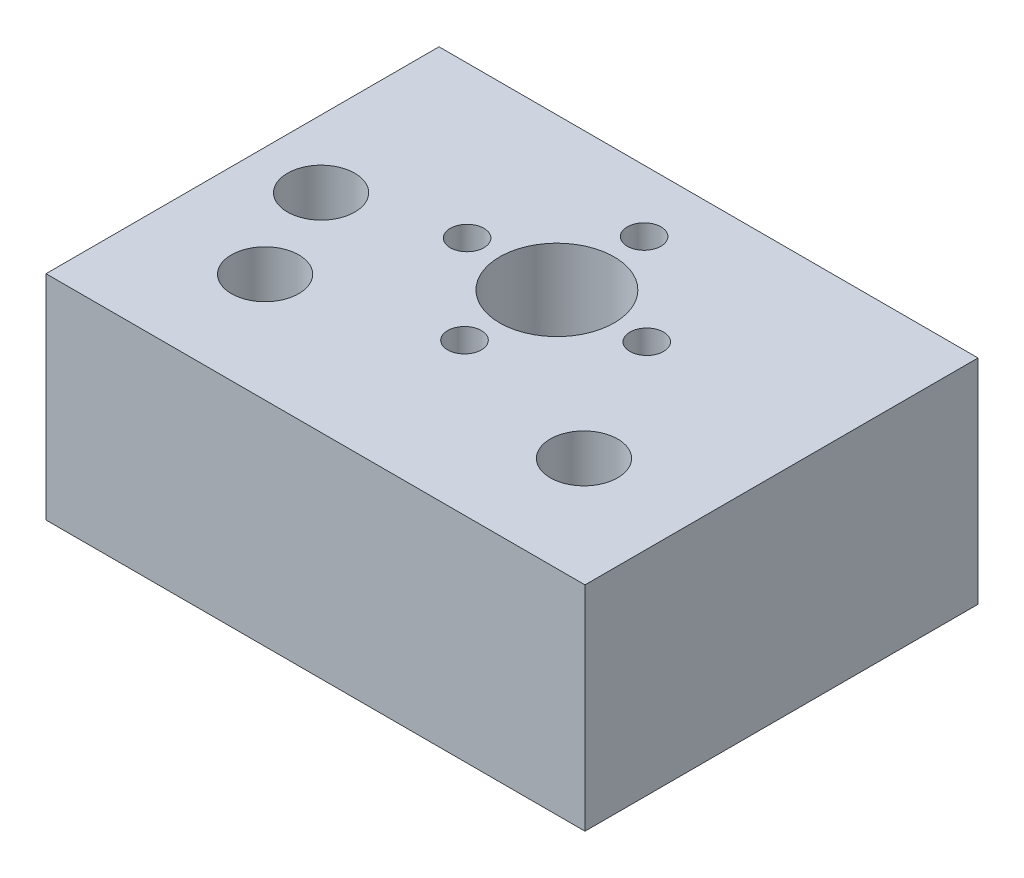
ISO-10303-21;
HEADER;
FILE_DESCRIPTION(('STEP AP214'),'2;1');
FILE_NAME('part.step','',(''),(''),'','','');
FILE_SCHEMA(('AUTOMOTIVE_DESIGN { 1 0 10303 214 1 1 1 1 }'));
ENDSEC;
DATA;
#1=APPLICATION_CONTEXT('core data for automotive mechanical design processes');
#2=APPLICATION_PROTOCOL_DEFINITION('international standard','automotive_design',2000,#1);
#3=PRODUCT_CONTEXT('',#1,'mechanical');
#4=PRODUCT('Part','Part','',(#3));
#5=PRODUCT_RELATED_PRODUCT_CATEGORY('part','',(#4));
#6=PRODUCT_DEFINITION_FORMATION('','',#4);
#7=PRODUCT_DEFINITION_CONTEXT('part definition',#1,'design');
#8=PRODUCT_DEFINITION('design','',#6,#7);
#9=PRODUCT_DEFINITION_SHAPE('','',#8);
#10=(LENGTH_UNIT() NAMED_UNIT(*) SI_UNIT(.MILLI.,.METRE.));
#11=(NAMED_UNIT(*) PLANE_ANGLE_UNIT() SI_UNIT($,.RADIAN.));
#12=(NAMED_UNIT(*) SI_UNIT($,.STERADIAN.) SOLID_ANGLE_UNIT());
#13=UNCERTAINTY_MEASURE_WITH_UNIT(LENGTH_MEASURE(1.E-05),#10,'distance_accuracy_value','');
#14=(GEOMETRIC_REPRESENTATION_CONTEXT(3) GLOBAL_UNCERTAINTY_ASSIGNED_CONTEXT((#13)) GLOBAL_UNIT_ASSIGNED_CONTEXT((#10,
#11,#12)) REPRESENTATION_CONTEXT('',''));
#15=CARTESIAN_POINT('',(0.,0.,0.));
#16=DIRECTION('',(0.,0.,1.));
#17=DIRECTION('',(1.,0.,0.));
#18=AXIS2_PLACEMENT_3D('',#15,#16,#17);
#19=CARTESIAN_POINT('',(0.,19.,0.));
#20=DIRECTION('',(1.,0.,0.));
#21=DIRECTION('',(0.,0.,-1.));
#22=AXIS2_PLACEMENT_3D('',#19,#20,#21);
#23=PLANE('',#22);
#24=DIRECTION('',(0.,0.,1.));
#25=VECTOR('',#24,1.);
#26=CARTESIAN_POINT('',(0.,0.,0.));
#27=LINE('',#26,#25);
#28=CARTESIAN_POINT('',(0.,0.,-35.));
#29=VERTEX_POINT('',#28);
#30=CARTESIAN_POINT('',(0.,0.,0.));
#31=VERTEX_POINT('',#30);
#32=EDGE_CURVE('E104',#29,#31,#27,.T.);
#33=ORIENTED_EDGE('',*,*,#32,.T.);
#34=DIRECTION('',(0.,-1.,0.));
#35=VECTOR('',#34,1.);
#36=CARTESIAN_POINT('',(0.,19.,0.));
#37=LINE('',#36,#35);
#38=CARTESIAN_POINT('',(0.,19.,0.));
#39=VERTEX_POINT('',#38);
#40=EDGE_CURVE('E11',#39,#31,#37,.T.);
#41=ORIENTED_EDGE('',*,*,#40,.F.);
#42=DIRECTION('',(0.,0.,1.));
#43=VECTOR('',#42,1.);
#44=CARTESIAN_POINT('',(0.,19.,0.));
#45=LINE('',#44,#43);
#46=CARTESIAN_POINT('',(0.,19.,-35.));
#47=VERTEX_POINT('',#46);
#48=EDGE_CURVE('E91',#47,#39,#45,.T.);
#49=ORIENTED_EDGE('',*,*,#48,.F.);
#50=DIRECTION('',(0.,-1.,0.));
#51=VECTOR('',#50,1.);
#52=CARTESIAN_POINT('',(0.,19.,-35.));
#53=LINE('',#52,#51);
#54=EDGE_CURVE('E100',#47,#29,#53,.T.);
#55=ORIENTED_EDGE('',*,*,#54,.T.);
#56=EDGE_LOOP('',(#33,#41,#49,#55));
#57=FACE_BOUND('',#56,.T.);
#58=ADVANCED_FACE('F33',(#57),#23,.F.);
#59=CARTESIAN_POINT('',(0.,19.,0.));
#60=DIRECTION('',(0.,0.,-1.));
#61=DIRECTION('',(-1.,0.,0.));
#62=AXIS2_PLACEMENT_3D('',#59,#60,#61);
#63=PLANE('',#62);
#64=DIRECTION('',(1.,0.,0.));
#65=VECTOR('',#64,1.);
#66=CARTESIAN_POINT('',(0.,0.,0.));
#67=LINE('',#66,#65);
#68=CARTESIAN_POINT('',(48.,0.,0.));
#69=VERTEX_POINT('',#68);
#70=EDGE_CURVE('E95',#31,#69,#67,.T.);
#71=ORIENTED_EDGE('',*,*,#70,.T.);
#72=DIRECTION('',(0.,-1.,0.));
#73=VECTOR('',#72,1.);
#74=CARTESIAN_POINT('',(48.,19.,0.));
#75=LINE('',#74,#73);
#76=CARTESIAN_POINT('',(48.,19.,0.));
#77=VERTEX_POINT('',#76);
#78=EDGE_CURVE('E47',#77,#69,#75,.T.);
#79=ORIENTED_EDGE('',*,*,#78,.F.);
#80=DIRECTION('',(1.,0.,0.));
#81=VECTOR('',#80,1.);
#82=CARTESIAN_POINT('',(0.,19.,0.));
#83=LINE('',#82,#81);
#84=EDGE_CURVE('E86',#39,#77,#83,.T.);
#85=ORIENTED_EDGE('',*,*,#84,.F.);
#86=ORIENTED_EDGE('',*,*,#40,.T.);
#87=EDGE_LOOP('',(#71,#79,#85,#86));
#88=FACE_BOUND('',#87,.T.);
#89=ADVANCED_FACE('F94',(#88),#63,.F.);
#90=CARTESIAN_POINT('',(48.,19.,0.));
#91=DIRECTION('',(-1.,0.,0.));
#92=DIRECTION('',(0.,0.,1.));
#93=AXIS2_PLACEMENT_3D('',#90,#91,#92);
#94=PLANE('',#93);
#95=DIRECTION('',(0.,0.,-1.));
#96=VECTOR('',#95,1.);
#97=CARTESIAN_POINT('',(48.,0.,0.));
#98=LINE('',#97,#96);
#99=CARTESIAN_POINT('',(48.,0.,-35.));
#100=VERTEX_POINT('',#99);
#101=EDGE_CURVE('E73',#69,#100,#98,.T.);
#102=ORIENTED_EDGE('',*,*,#101,.T.);
#103=DIRECTION('',(0.,-1.,0.));
#104=VECTOR('',#103,1.);
#105=CARTESIAN_POINT('',(48.,19.,-35.));
#106=LINE('',#105,#104);
#107=CARTESIAN_POINT('',(48.,19.,-35.));
#108=VERTEX_POINT('',#107);
#109=EDGE_CURVE('E96',#108,#100,#106,.T.);
#110=ORIENTED_EDGE('',*,*,#109,.F.);
#111=DIRECTION('',(0.,0.,-1.));
#112=VECTOR('',#111,1.);
#113=CARTESIAN_POINT('',(48.,19.,0.));
#114=LINE('',#113,#112);
#115=EDGE_CURVE('E89',#77,#108,#114,.T.);
#116=ORIENTED_EDGE('',*,*,#115,.F.);
#117=ORIENTED_EDGE('',*,*,#78,.T.);
#118=EDGE_LOOP('',(#102,#110,#116,#117));
#119=FACE_BOUND('',#118,.T.);
#120=ADVANCED_FACE('F98',(#119),#94,.F.);
#121=CARTESIAN_POINT('',(0.,19.,-35.));
#122=DIRECTION('',(0.,0.,1.));
#123=DIRECTION('',(1.,0.,0.));
#124=AXIS2_PLACEMENT_3D('',#121,#122,#123);
#125=PLANE('',#124);
#126=CARTESIAN_POINT('',(5.99999999999999,9.5,-35.));
#127=DIRECTION('',(0.,0.,-1.));
#128=DIRECTION('',(-1.,0.,0.));
#129=AXIS2_PLACEMENT_3D('',#126,#127,#128);
#130=CIRCLE('',#129,2.);
#131=CARTESIAN_POINT('',(3.99999999999999,9.5,-35.));
#132=VERTEX_POINT('',#131);
#133=EDGE_CURVE('E139',#132,#132,#130,.T.);
#134=ORIENTED_EDGE('',*,*,#133,.F.);
#135=EDGE_LOOP('',(#134));
#136=FACE_BOUND('',#135,.T.);
#137=DIRECTION('',(-1.,0.,0.));
#138=VECTOR('',#137,1.);
#139=CARTESIAN_POINT('',(0.,0.,-35.));
#140=LINE('',#139,#138);
#141=EDGE_CURVE('E79',#100,#29,#140,.T.);
#142=ORIENTED_EDGE('',*,*,#141,.T.);
#143=ORIENTED_EDGE('',*,*,#54,.F.);
#144=DIRECTION('',(-1.,0.,0.));
#145=VECTOR('',#144,1.);
#146=CARTESIAN_POINT('',(0.,19.,-35.));
#147=LINE('',#146,#145);
#148=EDGE_CURVE('E56',#108,#47,#147,.T.);
#149=ORIENTED_EDGE('',*,*,#148,.F.);
#150=ORIENTED_EDGE('',*,*,#109,.T.);
#151=EDGE_LOOP('',(#142,#143,#149,#150));
#152=FACE_BOUND('',#151,.T.);
#153=ADVANCED_FACE('F179',(#136,#152),#125,.F.);
#154=CARTESIAN_POINT('',(0.,19.,0.));
#155=DIRECTION('',(0.,-1.,0.));
#156=DIRECTION('',(0.,0.,-1.));
#157=AXIS2_PLACEMENT_3D('',#154,#155,#156);
#158=PLANE('',#157);
#159=CARTESIAN_POINT('',(23.7676352952459,19.,-29.4966247032098));
#160=DIRECTION('',(0.,1.,0.));
#161=DIRECTION('',(0.,0.,1.));
#162=AXIS2_PLACEMENT_3D('',#159,#160,#161);
#163=CIRCLE('',#162,1.5);
#164=CARTESIAN_POINT('',(23.7676352952459,19.,-27.9966247032098));
#165=VERTEX_POINT('',#164);
#166=EDGE_CURVE('E161',#165,#165,#163,.T.);
#167=ORIENTED_EDGE('',*,*,#166,.F.);
#168=EDGE_LOOP('',(#167));
#169=FACE_BOUND('',#168,.T.);
#170=CARTESIAN_POINT('',(16.,19.,-21.5));
#171=DIRECTION('',(0.,1.,0.));
#172=DIRECTION('',(0.,0.,1.));
#173=AXIS2_PLACEMENT_3D('',#170,#171,#172);
#174=CIRCLE('',#173,1.5);
#175=CARTESIAN_POINT('',(16.,19.,-20.));
#176=VERTEX_POINT('',#175);
#177=EDGE_CURVE('E155',#176,#176,#174,.T.);
#178=ORIENTED_EDGE('',*,*,#177,.F.);
#179=EDGE_LOOP('',(#178));
#180=FACE_BOUND('',#179,.T.);
#181=CARTESIAN_POINT('',(32.,19.,-21.5));
#182=DIRECTION('',(0.,1.,0.));
#183=DIRECTION('',(0.,0.,1.));
#184=AXIS2_PLACEMENT_3D('',#181,#182,#183);
#185=CIRCLE('',#184,1.5);
#186=CARTESIAN_POINT('',(32.,19.,-20.));
#187=VERTEX_POINT('',#186);
#188=EDGE_CURVE('E149',#187,#187,#185,.T.);
#189=ORIENTED_EDGE('',*,*,#188,.F.);
#190=EDGE_LOOP('',(#189));
#191=FACE_BOUND('',#190,.T.);
#192=CARTESIAN_POINT('',(23.7676352952459,19.,-13.5033752967902));
#193=DIRECTION('',(0.,1.,0.));
#194=DIRECTION('',(0.,0.,1.));
#195=AXIS2_PLACEMENT_3D('',#192,#193,#194);
#196=CIRCLE('',#195,1.5);
#197=CARTESIAN_POINT('',(23.7676352952459,19.,-12.0033752967902));
#198=VERTEX_POINT('',#197);
#199=EDGE_CURVE('E143',#198,#198,#196,.T.);
#200=ORIENTED_EDGE('',*,*,#199,.F.);
#201=EDGE_LOOP('',(#200));
#202=FACE_BOUND('',#201,.T.);
#203=CARTESIAN_POINT('',(5.99999999999999,19.,-18.5));
#204=DIRECTION('',(0.,-1.,0.));
#205=DIRECTION('',(0.,0.,-1.));
#206=AXIS2_PLACEMENT_3D('',#203,#204,#205);
#207=CIRCLE('',#206,3.);
#208=CARTESIAN_POINT('',(5.99999999999999,19.,-21.5));
#209=VERTEX_POINT('',#208);
#210=EDGE_CURVE('E129',#209,#209,#207,.T.);
#211=ORIENTED_EDGE('',*,*,#210,.T.);
#212=EDGE_LOOP('',(#211));
#213=FACE_BOUND('',#212,.T.);
#214=CARTESIAN_POINT('',(9.79999999999999,19.,-9.71000000000001));
#215=DIRECTION('',(0.,1.,0.));
#216=DIRECTION('',(0.,0.,1.));
#217=AXIS2_PLACEMENT_3D('',#214,#215,#216);
#218=CIRCLE('',#217,3.);
#219=CARTESIAN_POINT('',(9.79999999999999,19.,-6.71000000000001));
#220=VERTEX_POINT('',#219);
#221=EDGE_CURVE('E122',#220,#220,#218,.T.);
#222=ORIENTED_EDGE('',*,*,#221,.F.);
#223=EDGE_LOOP('',(#222));
#224=FACE_BOUND('',#223,.T.);
#225=CARTESIAN_POINT('',(38.2,19.,-9.71000000000001));
#226=DIRECTION('',(0.,1.,0.));
#227=DIRECTION('',(0.,0.,1.));
#228=AXIS2_PLACEMENT_3D('',#225,#226,#227);
#229=CIRCLE('',#228,3.);
#230=CARTESIAN_POINT('',(38.2,19.,-6.71000000000001));
#231=VERTEX_POINT('',#230);
#232=EDGE_CURVE('E128',#231,#231,#229,.T.);
#233=ORIENTED_EDGE('',*,*,#232,.F.);
#234=EDGE_LOOP('',(#233));
#235=FACE_BOUND('',#234,.T.);
#236=CARTESIAN_POINT('',(24.,19.,-21.5));
#237=DIRECTION('',(0.,1.,0.));
#238=DIRECTION('',(0.,0.,1.));
#239=AXIS2_PLACEMENT_3D('',#236,#237,#238);
#240=CIRCLE('',#239,5.1);
#241=CARTESIAN_POINT('',(24.,19.,-16.4));
#242=VERTEX_POINT('',#241);
#243=EDGE_CURVE('E113',#242,#242,#240,.T.);
#244=ORIENTED_EDGE('',*,*,#243,.F.);
#245=EDGE_LOOP('',(#244));
#246=FACE_BOUND('',#245,.T.);
#247=ORIENTED_EDGE('',*,*,#48,.T.);
#248=ORIENTED_EDGE('',*,*,#84,.T.);
#249=ORIENTED_EDGE('',*,*,#115,.T.);
#250=ORIENTED_EDGE('',*,*,#148,.T.);
#251=EDGE_LOOP('',(#247,#248,#249,#250));
#252=FACE_BOUND('',#251,.T.);
#253=ADVANCED_FACE('F87',(#169,#180,#191,#202,#213,#224,#235,#246,#252),#158,.F.);
#254=CARTESIAN_POINT('',(0.,0.,0.));
#255=DIRECTION('',(0.,-1.,0.));
#256=DIRECTION('',(0.,0.,-1.));
#257=AXIS2_PLACEMENT_3D('',#254,#255,#256);
#258=PLANE('',#257);
#259=CARTESIAN_POINT('',(5.99999999999999,0.,-18.5));
#260=DIRECTION('',(0.,-1.,0.));
#261=DIRECTION('',(0.,0.,-1.));
#262=AXIS2_PLACEMENT_3D('',#259,#260,#261);
#263=CIRCLE('',#262,3.);
#264=CARTESIAN_POINT('',(5.99999999999999,0.,-21.5));
#265=VERTEX_POINT('',#264);
#266=EDGE_CURVE('E134',#265,#265,#263,.T.);
#267=ORIENTED_EDGE('',*,*,#266,.F.);
#268=EDGE_LOOP('',(#267));
#269=FACE_BOUND('',#268,.T.);
#270=CARTESIAN_POINT('',(9.79999999999999,0.,-9.71000000000001));
#271=DIRECTION('',(0.,1.,0.));
#272=DIRECTION('',(0.,0.,1.));
#273=AXIS2_PLACEMENT_3D('',#270,#271,#272);
#274=CIRCLE('',#273,3.);
#275=CARTESIAN_POINT('',(9.79999999999999,0.,-6.71000000000001));
#276=VERTEX_POINT('',#275);
#277=EDGE_CURVE('E117',#276,#276,#274,.T.);
#278=ORIENTED_EDGE('',*,*,#277,.T.);
#279=EDGE_LOOP('',(#278));
#280=FACE_BOUND('',#279,.T.);
#281=CARTESIAN_POINT('',(38.2,0.,-9.71000000000001));
#282=DIRECTION('',(0.,1.,0.));
#283=DIRECTION('',(0.,0.,1.));
#284=AXIS2_PLACEMENT_3D('',#281,#282,#283);
#285=CIRCLE('',#284,3.);
#286=CARTESIAN_POINT('',(38.2,0.,-6.71000000000001));
#287=VERTEX_POINT('',#286);
#288=EDGE_CURVE('E125',#287,#287,#285,.T.);
#289=ORIENTED_EDGE('',*,*,#288,.T.);
#290=EDGE_LOOP('',(#289));
#291=FACE_BOUND('',#290,.T.);
#292=CARTESIAN_POINT('',(24.,0.,-21.5));
#293=DIRECTION('',(0.,-1.,0.));
#294=DIRECTION('',(0.,0.,-1.));
#295=AXIS2_PLACEMENT_3D('',#292,#293,#294);
#296=CIRCLE('',#295,5.1);
#297=CARTESIAN_POINT('',(24.,0.,-26.6));
#298=VERTEX_POINT('',#297);
#299=EDGE_CURVE('E107',#298,#298,#296,.T.);
#300=ORIENTED_EDGE('',*,*,#299,.F.);
#301=EDGE_LOOP('',(#300));
#302=FACE_BOUND('',#301,.T.);
#303=ORIENTED_EDGE('',*,*,#32,.F.);
#304=ORIENTED_EDGE('',*,*,#141,.F.);
#305=ORIENTED_EDGE('',*,*,#101,.F.);
#306=ORIENTED_EDGE('',*,*,#70,.F.);
#307=EDGE_LOOP('',(#303,#304,#305,#306));
#308=FACE_BOUND('',#307,.T.);
#309=ADVANCED_FACE('F178',(#269,#280,#291,#302,#308),#258,.T.);
#310=CARTESIAN_POINT('',(24.,-6.,-21.5));
#311=DIRECTION('',(0.,1.,0.));
#312=DIRECTION('',(0.,0.,1.));
#313=AXIS2_PLACEMENT_3D('',#310,#311,#312);
#314=CYLINDRICAL_SURFACE('',#313,5.1);
#315=ORIENTED_EDGE('',*,*,#299,.T.);
#316=EDGE_LOOP('',(#315));
#317=FACE_BOUND('',#316,.T.);
#318=ORIENTED_EDGE('',*,*,#243,.T.);
#319=EDGE_LOOP('',(#318));
#320=FACE_BOUND('',#319,.T.);
#321=ADVANCED_FACE('F197',(#317,#320),#314,.F.);
#322=CARTESIAN_POINT('',(38.2,0.,-9.71000000000001));
#323=DIRECTION('',(0.,1.,0.));
#324=DIRECTION('',(0.,0.,1.));
#325=AXIS2_PLACEMENT_3D('',#322,#323,#324);
#326=CYLINDRICAL_SURFACE('',#325,3.);
#327=ORIENTED_EDGE('',*,*,#288,.F.);
#328=EDGE_LOOP('',(#327));
#329=FACE_BOUND('',#328,.T.);
#330=ORIENTED_EDGE('',*,*,#232,.T.);
#331=EDGE_LOOP('',(#330));
#332=FACE_BOUND('',#331,.T.);
#333=ADVANCED_FACE('F194',(#329,#332),#326,.F.);
#334=CARTESIAN_POINT('',(9.79999999999999,0.,-9.71000000000001));
#335=DIRECTION('',(0.,1.,0.));
#336=DIRECTION('',(0.,0.,1.));
#337=AXIS2_PLACEMENT_3D('',#334,#335,#336);
#338=CYLINDRICAL_SURFACE('',#337,3.);
#339=ORIENTED_EDGE('',*,*,#277,.F.);
#340=EDGE_LOOP('',(#339));
#341=FACE_BOUND('',#340,.T.);
#342=ORIENTED_EDGE('',*,*,#221,.T.);
#343=EDGE_LOOP('',(#342));
#344=FACE_BOUND('',#343,.T.);
#345=ADVANCED_FACE('F196',(#341,#344),#338,.F.);
#346=CARTESIAN_POINT('',(5.99999999999999,19.,-18.5));
#347=DIRECTION('',(0.,-1.,0.));
#348=DIRECTION('',(0.,0.,-1.));
#349=AXIS2_PLACEMENT_3D('',#346,#347,#348);
#350=CYLINDRICAL_SURFACE('',#349,3.);
#351=CARTESIAN_POINT('',(5.99999999999999,11.5,-21.5));
#352=CARTESIAN_POINT('',(6.10048471666807,11.5000005496325,-21.5000004164484));
#353=CARTESIAN_POINT('',(6.20096908713289,11.4923860300445,-21.4949080275339));
#354=CARTESIAN_POINT('',(6.39873305803167,11.4624031358943,-21.4750465242381));
#355=CARTESIAN_POINT('',(6.496011113955,11.4400277568767,-21.4602728158123));
#356=CARTESIAN_POINT('',(6.68421230785424,11.3818922826752,-21.4225048240471));
#357=CARTESIAN_POINT('',(6.77516287265755,11.3461948599921,-21.3995490549332));
#358=CARTESIAN_POINT('',(6.94941529099725,11.2629366367285,-21.3472613787744));
#359=CARTESIAN_POINT('',(7.03271603160966,11.2153741136994,-21.3179285460551));
#360=CARTESIAN_POINT('',(7.1972847007701,11.1053430626326,-21.2522732936984));
#361=CARTESIAN_POINT('',(7.27778030546067,11.0419521392571,-21.2155689757932));
#362=CARTESIAN_POINT('',(7.42772804469273,10.9042699513416,-21.1398231308347));
#363=CARTESIAN_POINT('',(7.49716405543887,10.8299630701623,-21.1007783035683));
#364=CARTESIAN_POINT('',(7.63422297745495,10.6589476323873,-21.0172826467879));
#365=CARTESIAN_POINT('',(7.69983186362749,10.5605543467965,-20.972950679378));
#366=CARTESIAN_POINT('',(7.81350357014174,10.3516366223535,-20.8908414735282));
#367=CARTESIAN_POINT('',(7.86159673426502,10.2411335984373,-20.8530529595467));
#368=CARTESIAN_POINT('',(7.92674035011437,10.0432887065784,-20.7997626664146));
#369=CARTESIAN_POINT('',(7.94874447236007,9.95847154712609,-20.780976278924));
#370=CARTESIAN_POINT('',(7.98150617785228,9.78525549525835,-20.752579696596));
#371=CARTESIAN_POINT('',(7.99228314651962,9.69686305127394,-20.7429536874415));
#372=CARTESIAN_POINT('',(8.00191364141227,9.51852522114353,-20.7343660560805));
#373=CARTESIAN_POINT('',(8.00071842917523,9.4285749765476,-20.735448025585));
#374=CARTESIAN_POINT('',(7.98637581333355,9.25036502650025,-20.7481977548343));
#375=CARTESIAN_POINT('',(7.97321828380392,9.16210681797187,-20.7598744828688));
#376=CARTESIAN_POINT('',(7.93664994217325,8.99353294875812,-20.7912718598996));
#377=CARTESIAN_POINT('',(7.91371711479477,8.91303866406123,-20.8106148832438));
#378=CARTESIAN_POINT('',(7.85870118583424,8.75697630902422,-20.8550962293362));
#379=CARTESIAN_POINT('',(7.8266150732855,8.68140986976135,-20.8802364585489));
#380=CARTESIAN_POINT('',(7.74673818732648,8.52097460464356,-20.9396419637795));
#381=CARTESIAN_POINT('',(7.69708052300444,8.43734009951691,-20.9747231774063));
#382=CARTESIAN_POINT('',(7.5866896043822,8.27861660471425,-21.0469153773344));
#383=CARTESIAN_POINT('',(7.52594268999614,8.20353834223793,-21.0840288270933));
#384=CARTESIAN_POINT('',(7.37981165322308,8.04745745439659,-21.1654334376372));
#385=CARTESIAN_POINT('',(7.29193938283656,7.96866595131724,-21.2095474472056));
#386=CARTESIAN_POINT('',(7.10200799908008,7.82680350546152,-21.2921810066521));
#387=CARTESIAN_POINT('',(6.99996229934369,7.76371785459102,-21.3307057764804));
#388=CARTESIAN_POINT('',(6.80485782709653,7.66652228137713,-21.3914540409036));
#389=CARTESIAN_POINT('',(6.71395764337191,7.62915663666106,-21.4153926116554));
#390=CARTESIAN_POINT('',(6.52603604393548,7.56789507437463,-21.455077190305));
#391=CARTESIAN_POINT('',(6.42901987900165,7.54398777286778,-21.4708301212754));
#392=CARTESIAN_POINT('',(6.23098545317228,7.510838834762,-21.4927588215681));
#393=CARTESIAN_POINT('',(6.12995181193415,7.50166053906174,-21.4988932246119));
#394=CARTESIAN_POINT('',(5.92755848061065,7.49875291143779,-21.5008311496515));
#395=CARTESIAN_POINT('',(5.82619881381337,7.50502249951123,-21.4966353938563));
#396=CARTESIAN_POINT('',(5.63354428279576,7.53162405556195,-21.4789958942427));
#397=CARTESIAN_POINT('',(5.5420425553208,7.55093729775522,-21.4662224639023));
#398=CARTESIAN_POINT('',(5.3638836075726,7.60159568601286,-21.4331844928484));
#399=CARTESIAN_POINT('',(5.27722716242886,7.63294275092821,-21.4129187574699));
#400=CARTESIAN_POINT('',(5.105335249534,7.70865229704492,-21.3649635252916));
#401=CARTESIAN_POINT('',(5.02050381536858,7.75368815408185,-21.3368987013579));
#402=CARTESIAN_POINT('',(4.8593169760427,7.85443328994627,-21.2760185561151));
#403=CARTESIAN_POINT('',(4.78296685179909,7.91014916053217,-21.2432003040394));
#404=CARTESIAN_POINT('',(4.62814554517676,8.04060786815751,-21.1695454665343));
#405=CARTESIAN_POINT('',(4.55124812430434,8.11696626007509,-21.1282615680017));
#406=CARTESIAN_POINT('',(4.41066031930551,8.28111142995712,-21.0457117308596));
#407=CARTESIAN_POINT('',(4.3469790634277,8.36890603910751,-21.0044458241785));
#408=CARTESIAN_POINT('',(4.23875223450686,8.54714241276812,-20.9293967897058));
#409=CARTESIAN_POINT('',(4.19304363874716,8.63673203346221,-20.895275970257));
#410=CARTESIAN_POINT('',(4.11503786259735,8.82387265244363,-20.8343897426615));
#411=CARTESIAN_POINT('',(4.0827165431781,8.92140893830462,-20.8076111252982));
#412=CARTESIAN_POINT('',(4.0376415653466,9.10456448719541,-20.7693320818263));
#413=CARTESIAN_POINT('',(4.02241402433774,9.18917180987601,-20.7559499802126));
#414=CARTESIAN_POINT('',(4.00300794076627,9.36057328131838,-20.738794664384));
#415=CARTESIAN_POINT('',(3.99881739714683,9.44736495113949,-20.7350110134782));
#416=CARTESIAN_POINT('',(4.00176078018733,9.62064305672369,-20.7376420114998));
#417=CARTESIAN_POINT('',(4.00890141232216,9.70712928137375,-20.7440626990746));
#418=CARTESIAN_POINT('',(4.03403002775253,9.87734352853211,-20.7661045240349));
#419=CARTESIAN_POINT('',(4.05203248271742,9.96106771382432,-20.7817379352762));
#420=CARTESIAN_POINT('',(4.10406964342505,10.1457111864812,-20.825268439048));
#421=CARTESIAN_POINT('',(4.14109812869234,10.2452677129433,-20.8553233357498));
#422=CARTESIAN_POINT('',(4.22915473763779,10.4354868343842,-20.9222216112131));
#423=CARTESIAN_POINT('',(4.2802025165874,10.5261366979917,-20.959074496867));
#424=CARTESIAN_POINT('',(4.39601719444847,10.6992818871362,-21.0361718657712));
#425=CARTESIAN_POINT('',(4.46101690105978,10.781598745423,-21.0764658739228));
#426=CARTESIAN_POINT('',(4.60328231968905,10.9353224782579,-21.1562830153784));
#427=CARTESIAN_POINT('',(4.68055178974251,11.0067259970292,-21.195805908324));
#428=CARTESIAN_POINT('',(4.85854267023025,11.1467121043091,-21.2763155196408));
#429=CARTESIAN_POINT('',(4.96103833044424,11.2134186401783,-21.3166980544999));
#430=CARTESIAN_POINT('',(5.17913144422877,11.3279132766653,-21.3877766587416));
#431=CARTESIAN_POINT('',(5.29470793755083,11.375731106824,-21.4184879344526));
#432=CARTESIAN_POINT('',(5.50856493016424,11.4411545781638,-21.461016448369));
#433=CARTESIAN_POINT('',(5.60498767474207,11.4631110390986,-21.4755148036894));
#434=CARTESIAN_POINT('',(5.80094198797605,11.4925280325381,-21.4950028014185));
#435=CARTESIAN_POINT('',(5.90047116381198,11.499999455596,-21.4999995875132));
#436=CARTESIAN_POINT('',(5.99999999999999,11.5,-21.5));
#437=B_SPLINE_CURVE_WITH_KNOTS('',3,(#351,#352,#353,#354,#355,#356,#357,#358,#359,#360,#361,
#362,#363,#364,#365,#366,#367,#368,#369,#370,#371,#372,#373,#374,#375,#376,#377,#378,#379,#380,
#381,#382,#383,#384,#385,#386,#387,#388,#389,#390,#391,#392,#393,#394,#395,#396,#397,#398,#399,
#400,#401,#402,#403,#404,#405,#406,#407,#408,#409,#410,#411,#412,#413,#414,#415,#416,#417,#418,
#419,#420,#421,#422,#423,#424,#425,#426,#427,#428,#429,#430,#431,#432,#433,#434,#435,#436),
.UNSPECIFIED.,.T.,.F.,(4,2,2,2,2,2,2,2,2,2,2,2,2,2,2,2,2,2,2,2,2,2,2,2,2,2,2,2,2,2,2,2,2,2,2,2,
2,2,2,2,2,2,4),(0.,0.3010532265054,0.602249414348689,0.902046153190232,1.20188643867387,
1.52717029000557,1.85292411604319,2.23006683295983,2.60655305445439,2.87433693676029,
3.14165767845809,3.41006711735378,3.67870397263352,3.93548862198022,4.19235783805078,
4.50147574660873,4.81097703780056,5.18718954496752,5.56304840301362,5.86524087696758,
6.16717735142813,6.47040883294251,6.77361911533415,7.05553084792472,7.3374875513827,
7.63652346829516,7.93574454945204,8.28228176141292,8.62905753175758,8.94649935304476,
9.26336626640723,9.52324048016135,9.78283200333091,10.0425772028455,10.302669238524,
10.6320660870419,10.9619271337795,11.2977924520448,11.6337608397015,12.0179535155883,
12.4015390656083,12.6999529136674,12.9981423125957),.UNSPECIFIED.);
#438=CARTESIAN_POINT('',(5.99999999999999,11.5,-21.5));
#439=VERTEX_POINT('',#438);
#440=EDGE_CURVE('E36',#439,#439,#437,.T.);
#441=ORIENTED_EDGE('',*,*,#440,.T.);
#442=EDGE_LOOP('',(#441));
#443=FACE_BOUND('',#442,.T.);
#444=ORIENTED_EDGE('',*,*,#210,.F.);
#445=EDGE_LOOP('',(#444));
#446=FACE_BOUND('',#445,.T.);
#447=ORIENTED_EDGE('',*,*,#266,.T.);
#448=EDGE_LOOP('',(#447));
#449=FACE_BOUND('',#448,.T.);
#450=ADVANCED_FACE('F204',(#443,#446,#449),#350,.F.);
#451=CARTESIAN_POINT('',(5.99999999999999,9.5,-18.));
#452=DIRECTION('',(0.,0.,-1.));
#453=DIRECTION('',(-1.,0.,0.));
#454=AXIS2_PLACEMENT_3D('',#451,#452,#453);
#455=CYLINDRICAL_SURFACE('',#454,2.);
#456=ORIENTED_EDGE('',*,*,#133,.T.);
#457=EDGE_LOOP('',(#456));
#458=FACE_BOUND('',#457,.T.);
#459=ORIENTED_EDGE('',*,*,#440,.F.);
#460=EDGE_LOOP('',(#459));
#461=FACE_BOUND('',#460,.T.);
#462=ADVANCED_FACE('F249',(#458,#461),#455,.F.);
#463=CARTESIAN_POINT('',(23.7676352952459,9.,-13.5033752967902));
#464=DIRECTION('',(0.,1.,0.));
#465=DIRECTION('',(0.,0.,1.));
#466=AXIS2_PLACEMENT_3D('',#463,#464,#465);
#467=CYLINDRICAL_SURFACE('',#466,1.5);
#468=CARTESIAN_POINT('',(23.7676352952459,9.,-13.5033752967902));
#469=DIRECTION('',(0.,1.,0.));
#470=DIRECTION('',(0.,0.,1.));
#471=AXIS2_PLACEMENT_3D('',#468,#469,#470);
#472=CIRCLE('',#471,1.5);
#473=CARTESIAN_POINT('',(23.7676352952459,9.,-12.0033752967902));
#474=VERTEX_POINT('',#473);
#475=EDGE_CURVE('E146',#474,#474,#472,.T.);
#476=ORIENTED_EDGE('',*,*,#475,.F.);
#477=EDGE_LOOP('',(#476));
#478=FACE_BOUND('',#477,.T.);
#479=ORIENTED_EDGE('',*,*,#199,.T.);
#480=EDGE_LOOP('',(#479));
#481=FACE_BOUND('',#480,.T.);
#482=ADVANCED_FACE('F253',(#478,#481),#467,.F.);
#483=CARTESIAN_POINT('',(23.7676352952459,9.,-13.5033752967902));
#484=DIRECTION('',(0.,1.,0.));
#485=DIRECTION('',(0.,0.,1.));
#486=AXIS2_PLACEMENT_3D('',#483,#484,#485);
#487=PLANE('',#486);
#488=ORIENTED_EDGE('',*,*,#475,.T.);
#489=EDGE_LOOP('',(#488));
#490=FACE_BOUND('',#489,.T.);
#491=ADVANCED_FACE('F258',(#490),#487,.T.);
#492=CARTESIAN_POINT('',(32.,9.,-21.5));
#493=DIRECTION('',(0.,1.,0.));
#494=DIRECTION('',(0.,0.,1.));
#495=AXIS2_PLACEMENT_3D('',#492,#493,#494);
#496=CYLINDRICAL_SURFACE('',#495,1.5);
#497=CARTESIAN_POINT('',(32.,9.,-21.5));
#498=DIRECTION('',(0.,1.,0.));
#499=DIRECTION('',(0.,0.,1.));
#500=AXIS2_PLACEMENT_3D('',#497,#498,#499);
#501=CIRCLE('',#500,1.5);
#502=CARTESIAN_POINT('',(32.,9.,-20.));
#503=VERTEX_POINT('',#502);
#504=EDGE_CURVE('E152',#503,#503,#501,.T.);
#505=ORIENTED_EDGE('',*,*,#504,.F.);
#506=EDGE_LOOP('',(#505));
#507=FACE_BOUND('',#506,.T.);
#508=ORIENTED_EDGE('',*,*,#188,.T.);
#509=EDGE_LOOP('',(#508));
#510=FACE_BOUND('',#509,.T.);
#511=ADVANCED_FACE('F268',(#507,#510),#496,.F.);
#512=CARTESIAN_POINT('',(32.,9.,-21.5));
#513=DIRECTION('',(0.,1.,0.));
#514=DIRECTION('',(0.,0.,1.));
#515=AXIS2_PLACEMENT_3D('',#512,#513,#514);
#516=PLANE('',#515);
#517=ORIENTED_EDGE('',*,*,#504,.T.);
#518=EDGE_LOOP('',(#517));
#519=FACE_BOUND('',#518,.T.);
#520=ADVANCED_FACE('F278',(#519),#516,.T.);
#521=CARTESIAN_POINT('',(16.,9.,-21.5));
#522=DIRECTION('',(0.,1.,0.));
#523=DIRECTION('',(0.,0.,1.));
#524=AXIS2_PLACEMENT_3D('',#521,#522,#523);
#525=CYLINDRICAL_SURFACE('',#524,1.5);
#526=CARTESIAN_POINT('',(16.,9.,-21.5));
#527=DIRECTION('',(0.,1.,0.));
#528=DIRECTION('',(0.,0.,1.));
#529=AXIS2_PLACEMENT_3D('',#526,#527,#528);
#530=CIRCLE('',#529,1.5);
#531=CARTESIAN_POINT('',(16.,9.,-20.));
#532=VERTEX_POINT('',#531);
#533=EDGE_CURVE('E158',#532,#532,#530,.T.);
#534=ORIENTED_EDGE('',*,*,#533,.F.);
#535=EDGE_LOOP('',(#534));
#536=FACE_BOUND('',#535,.T.);
#537=ORIENTED_EDGE('',*,*,#177,.T.);
#538=EDGE_LOOP('',(#537));
#539=FACE_BOUND('',#538,.T.);
#540=ADVANCED_FACE('F288',(#536,#539),#525,.F.);
#541=CARTESIAN_POINT('',(16.,9.,-21.5));
#542=DIRECTION('',(0.,1.,0.));
#543=DIRECTION('',(0.,0.,1.));
#544=AXIS2_PLACEMENT_3D('',#541,#542,#543);
#545=PLANE('',#544);
#546=ORIENTED_EDGE('',*,*,#533,.T.);
#547=EDGE_LOOP('',(#546));
#548=FACE_BOUND('',#547,.T.);
#549=ADVANCED_FACE('F172',(#548),#545,.T.);
#550=CARTESIAN_POINT('',(23.7676352952459,9.,-29.4966247032098));
#551=DIRECTION('',(0.,1.,0.));
#552=DIRECTION('',(0.,0.,1.));
#553=AXIS2_PLACEMENT_3D('',#550,#551,#552);
#554=CYLINDRICAL_SURFACE('',#553,1.5);
#555=CARTESIAN_POINT('',(23.7676352952459,9.,-29.4966247032098));
#556=DIRECTION('',(0.,1.,0.));
#557=DIRECTION('',(0.,0.,1.));
#558=AXIS2_PLACEMENT_3D('',#555,#556,#557);
#559=CIRCLE('',#558,1.5);
#560=CARTESIAN_POINT('',(23.7676352952459,9.,-27.9966247032098));
#561=VERTEX_POINT('',#560);
#562=EDGE_CURVE('E142',#561,#561,#559,.T.);
#563=ORIENTED_EDGE('',*,*,#562,.F.);
#564=EDGE_LOOP('',(#563));
#565=FACE_BOUND('',#564,.T.);
#566=ORIENTED_EDGE('',*,*,#166,.T.);
#567=EDGE_LOOP('',(#566));
#568=FACE_BOUND('',#567,.T.);
#569=ADVANCED_FACE('F169',(#565,#568),#554,.F.);
#570=CARTESIAN_POINT('',(23.7676352952459,9.,-29.4966247032098));
#571=DIRECTION('',(0.,1.,0.));
#572=DIRECTION('',(0.,0.,1.));
#573=AXIS2_PLACEMENT_3D('',#570,#571,#572);
#574=PLANE('',#573);
#575=ORIENTED_EDGE('',*,*,#562,.T.);
#576=EDGE_LOOP('',(#575));
#577=FACE_BOUND('',#576,.T.);
#578=ADVANCED_FACE('F167',(#577),#574,.T.);
#579=CLOSED_SHELL('',(#58,#89,#120,#153,#253,#309,#321,#333,#345,#450,#462,#482,#491,#511,#520,
#540,#549,#569,#578));
#580=MANIFOLD_SOLID_BREP('B2',#579);
#581=ADVANCED_BREP_SHAPE_REPRESENTATION('',(#18,#580),#14);
#582=SHAPE_DEFINITION_REPRESENTATION(#9,#581);
ENDSEC;
END-ISO-10303-21;
